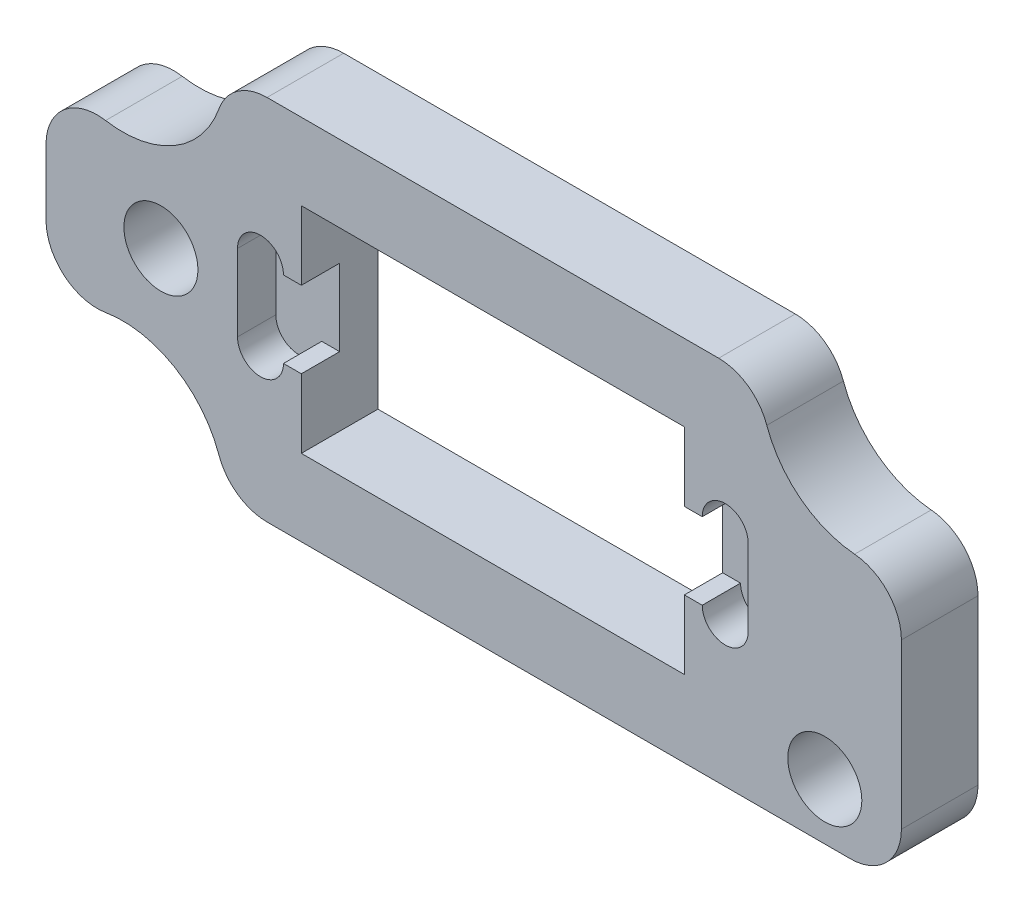
ISO-10303-21;
HEADER;
FILE_DESCRIPTION(('STEP AP214'),'2;1');
FILE_NAME('part.step','',(''),(''),'','','');
FILE_SCHEMA(('AUTOMOTIVE_DESIGN { 1 0 10303 214 1 1 1 1 }'));
ENDSEC;
DATA;
#1=APPLICATION_CONTEXT('core data for automotive mechanical design processes');
#2=APPLICATION_PROTOCOL_DEFINITION('international standard','automotive_design',2000,#1);
#3=PRODUCT_CONTEXT('',#1,'mechanical');
#4=PRODUCT('Part','Part','',(#3));
#5=PRODUCT_RELATED_PRODUCT_CATEGORY('part','',(#4));
#6=PRODUCT_DEFINITION_FORMATION('','',#4);
#7=PRODUCT_DEFINITION_CONTEXT('part definition',#1,'design');
#8=PRODUCT_DEFINITION('design','',#6,#7);
#9=PRODUCT_DEFINITION_SHAPE('','',#8);
#10=(LENGTH_UNIT() NAMED_UNIT(*) SI_UNIT(.MILLI.,.METRE.));
#11=(NAMED_UNIT(*) PLANE_ANGLE_UNIT() SI_UNIT($,.RADIAN.));
#12=(NAMED_UNIT(*) SI_UNIT($,.STERADIAN.) SOLID_ANGLE_UNIT());
#13=UNCERTAINTY_MEASURE_WITH_UNIT(LENGTH_MEASURE(1.E-05),#10,'distance_accuracy_value','');
#14=(GEOMETRIC_REPRESENTATION_CONTEXT(3) GLOBAL_UNCERTAINTY_ASSIGNED_CONTEXT((#13)) GLOBAL_UNIT_ASSIGNED_CONTEXT((#10,
#11,#12)) REPRESENTATION_CONTEXT('',''));
#15=CARTESIAN_POINT('',(0.,0.,0.));
#16=DIRECTION('',(0.,0.,1.));
#17=DIRECTION('',(1.,0.,0.));
#18=AXIS2_PLACEMENT_3D('',#15,#16,#17);
#19=CARTESIAN_POINT('',(0.,0.,3.));
#20=DIRECTION('',(0.,0.,-1.));
#21=DIRECTION('',(-1.,0.,0.));
#22=AXIS2_PLACEMENT_3D('',#19,#20,#21);
#23=PLANE('',#22);
#24=CARTESIAN_POINT('',(13.,-5.,3.));
#25=DIRECTION('',(0.,0.,1.));
#26=DIRECTION('',(1.,0.,0.));
#27=AXIS2_PLACEMENT_3D('',#24,#25,#26);
#28=CIRCLE('',#27,1.45);
#29=CARTESIAN_POINT('',(14.45,-5.,3.));
#30=VERTEX_POINT('',#29);
#31=EDGE_CURVE('E682',#30,#30,#28,.T.);
#32=ORIENTED_EDGE('',*,*,#31,.F.);
#33=EDGE_LOOP('',(#32));
#34=FACE_BOUND('',#33,.T.);
#35=CARTESIAN_POINT('',(-13.,0.,3.));
#36=DIRECTION('',(0.,0.,1.));
#37=DIRECTION('',(1.,0.,0.));
#38=AXIS2_PLACEMENT_3D('',#35,#36,#37);
#39=CIRCLE('',#38,1.45);
#40=CARTESIAN_POINT('',(-11.55,0.,3.));
#41=VERTEX_POINT('',#40);
#42=EDGE_CURVE('E393',#41,#41,#39,.T.);
#43=ORIENTED_EDGE('',*,*,#42,.F.);
#44=EDGE_LOOP('',(#43));
#45=FACE_BOUND('',#44,.T.);
#46=DIRECTION('',(1.,0.,0.));
#47=VECTOR('',#46,1.);
#48=CARTESIAN_POINT('',(-17.5,-7.2,3.));
#49=LINE('',#48,#47);
#50=CARTESIAN_POINT('',(-8.84314575050762,-7.2,3.));
#51=VERTEX_POINT('',#50);
#52=CARTESIAN_POINT('',(14.,-7.2,3.));
#53=VERTEX_POINT('',#52);
#54=EDGE_CURVE('E364',#51,#53,#49,.T.);
#55=ORIENTED_EDGE('',*,*,#54,.T.);
#56=CARTESIAN_POINT('',(14.,-5.2,3.));
#57=DIRECTION('',(0.,0.,-1.));
#58=DIRECTION('',(-1.,0.,0.));
#59=AXIS2_PLACEMENT_3D('',#56,#57,#58);
#60=CIRCLE('',#59,2.);
#61=CARTESIAN_POINT('',(16.,-5.2,3.));
#62=VERTEX_POINT('',#61);
#63=EDGE_CURVE('E419',#53,#62,#60,.F.);
#64=ORIENTED_EDGE('',*,*,#63,.T.);
#65=DIRECTION('',(0.,-1.,0.));
#66=VECTOR('',#65,1.);
#67=CARTESIAN_POINT('',(16.,-7.2,3.));
#68=LINE('',#67,#66);
#69=CARTESIAN_POINT('',(16.,1.2208696284493,3.));
#70=VERTEX_POINT('',#69);
#71=EDGE_CURVE('E649',#70,#62,#68,.T.);
#72=ORIENTED_EDGE('',*,*,#71,.F.);
#73=CARTESIAN_POINT('',(14.,1.2208696284493,3.));
#74=DIRECTION('',(0.,0.,-1.));
#75=DIRECTION('',(-1.,0.,0.));
#76=AXIS2_PLACEMENT_3D('',#73,#74,#75);
#77=CIRCLE('',#76,2.);
#78=CARTESIAN_POINT('',(14.1666666666667,3.21391308563287,3.));
#79=VERTEX_POINT('',#78);
#80=EDGE_CURVE('E416',#70,#79,#77,.F.);
#81=ORIENTED_EDGE('',*,*,#80,.T.);
#82=CARTESIAN_POINT('',(14.5,7.2,3.));
#83=DIRECTION('',(0.,0.,1.));
#84=DIRECTION('',(-1.,0.,0.));
#85=AXIS2_PLACEMENT_3D('',#82,#83,#84);
#86=CIRCLE('',#85,4.);
#87=CARTESIAN_POINT('',(10.7287638336718,5.86666666666667,3.));
#88=VERTEX_POINT('',#87);
#89=EDGE_CURVE('E504',#88,#79,#86,.T.);
#90=ORIENTED_EDGE('',*,*,#89,.F.);
#91=CARTESIAN_POINT('',(8.84314575050763,5.2,3.));
#92=DIRECTION('',(0.,0.,-1.));
#93=DIRECTION('',(-1.,0.,0.));
#94=AXIS2_PLACEMENT_3D('',#91,#92,#93);
#95=CIRCLE('',#94,2.);
#96=CARTESIAN_POINT('',(8.84314575050763,7.2,3.));
#97=VERTEX_POINT('',#96);
#98=EDGE_CURVE('E410',#88,#97,#95,.F.);
#99=ORIENTED_EDGE('',*,*,#98,.T.);
#100=DIRECTION('',(-1.,0.,0.));
#101=VECTOR('',#100,1.);
#102=CARTESIAN_POINT('',(-17.5,7.2,3.));
#103=LINE('',#102,#101);
#104=CARTESIAN_POINT('',(-8.84314575050762,7.2,3.));
#105=VERTEX_POINT('',#104);
#106=EDGE_CURVE('E355',#97,#105,#103,.T.);
#107=ORIENTED_EDGE('',*,*,#106,.T.);
#108=CARTESIAN_POINT('',(-8.84314575050762,5.2,3.));
#109=DIRECTION('',(0.,0.,-1.));
#110=DIRECTION('',(-1.,0.,0.));
#111=AXIS2_PLACEMENT_3D('',#108,#109,#110);
#112=CIRCLE('',#111,2.);
#113=CARTESIAN_POINT('',(-10.7287638336717,5.86666666666667,3.));
#114=VERTEX_POINT('',#113);
#115=EDGE_CURVE('E401',#105,#114,#112,.F.);
#116=ORIENTED_EDGE('',*,*,#115,.T.);
#117=CARTESIAN_POINT('',(-14.5,7.2,3.));
#118=DIRECTION('',(0.,0.,1.));
#119=DIRECTION('',(1.,0.,0.));
#120=AXIS2_PLACEMENT_3D('',#117,#118,#119);
#121=CIRCLE('',#120,4.);
#122=CARTESIAN_POINT('',(-15.1666666666667,3.25594681126692,3.));
#123=VERTEX_POINT('',#122);
#124=EDGE_CURVE('E484',#123,#114,#121,.T.);
#125=ORIENTED_EDGE('',*,*,#124,.F.);
#126=CARTESIAN_POINT('',(-15.5,1.28392021690038,3.));
#127=DIRECTION('',(0.,0.,-1.));
#128=DIRECTION('',(-1.,0.,0.));
#129=AXIS2_PLACEMENT_3D('',#126,#127,#128);
#130=CIRCLE('',#129,2.);
#131=CARTESIAN_POINT('',(-17.5,1.28392021690038,3.));
#132=VERTEX_POINT('',#131);
#133=EDGE_CURVE('E407',#123,#132,#130,.F.);
#134=ORIENTED_EDGE('',*,*,#133,.T.);
#135=DIRECTION('',(0.,-1.,0.));
#136=VECTOR('',#135,1.);
#137=CARTESIAN_POINT('',(-17.5,-7.2,3.));
#138=LINE('',#137,#136);
#139=CARTESIAN_POINT('',(-17.5,-1.28392021690038,3.));
#140=VERTEX_POINT('',#139);
#141=EDGE_CURVE('E359',#132,#140,#138,.T.);
#142=ORIENTED_EDGE('',*,*,#141,.T.);
#143=CARTESIAN_POINT('',(-15.5,-1.28392021690038,3.));
#144=DIRECTION('',(0.,0.,-1.));
#145=DIRECTION('',(-1.,0.,0.));
#146=AXIS2_PLACEMENT_3D('',#143,#144,#145);
#147=CIRCLE('',#146,2.);
#148=CARTESIAN_POINT('',(-15.1666666666667,-3.25594681126692,3.));
#149=VERTEX_POINT('',#148);
#150=EDGE_CURVE('E404',#140,#149,#147,.F.);
#151=ORIENTED_EDGE('',*,*,#150,.T.);
#152=CARTESIAN_POINT('',(-14.5,-7.2,3.));
#153=DIRECTION('',(0.,0.,1.));
#154=DIRECTION('',(-1.,0.,0.));
#155=AXIS2_PLACEMENT_3D('',#152,#153,#154);
#156=CIRCLE('',#155,4.);
#157=CARTESIAN_POINT('',(-10.7287638336717,-5.86666666666667,3.));
#158=VERTEX_POINT('',#157);
#159=EDGE_CURVE('E642',#158,#149,#156,.T.);
#160=ORIENTED_EDGE('',*,*,#159,.F.);
#161=CARTESIAN_POINT('',(-8.84314575050762,-5.2,3.));
#162=DIRECTION('',(0.,0.,-1.));
#163=DIRECTION('',(-1.,0.,0.));
#164=AXIS2_PLACEMENT_3D('',#161,#162,#163);
#165=CIRCLE('',#164,2.);
#166=EDGE_CURVE('E413',#158,#51,#165,.F.);
#167=ORIENTED_EDGE('',*,*,#166,.T.);
#168=EDGE_LOOP('',(#55,#64,#72,#81,#90,#99,#107,#116,#125,#134,#142,#151,#160,#167));
#169=FACE_BOUND('',#168,.T.);
#170=DIRECTION('',(1.,0.,0.));
#171=VECTOR('',#170,1.);
#172=CARTESIAN_POINT('',(-10.,-1.5,3.));
#173=LINE('',#172,#171);
#174=CARTESIAN_POINT('',(-8.2,-1.5,3.));
#175=VERTEX_POINT('',#174);
#176=CARTESIAN_POINT('',(-7.5,-1.5,3.));
#177=VERTEX_POINT('',#176);
#178=EDGE_CURVE('E275',#175,#177,#173,.T.);
#179=ORIENTED_EDGE('',*,*,#178,.F.);
#180=CARTESIAN_POINT('',(-9.1,-1.5,3.));
#181=DIRECTION('',(0.,0.,1.));
#182=DIRECTION('',(1.,0.,0.));
#183=AXIS2_PLACEMENT_3D('',#180,#181,#182);
#184=CIRCLE('',#183,0.9);
#185=CARTESIAN_POINT('',(-10.,-1.5,3.));
#186=VERTEX_POINT('',#185);
#187=EDGE_CURVE('E665',#186,#175,#184,.T.);
#188=ORIENTED_EDGE('',*,*,#187,.F.);
#189=DIRECTION('',(0.,-1.,0.));
#190=VECTOR('',#189,1.);
#191=CARTESIAN_POINT('',(-10.,-1.5,3.));
#192=LINE('',#191,#190);
#193=CARTESIAN_POINT('',(-10.,1.5,3.));
#194=VERTEX_POINT('',#193);
#195=EDGE_CURVE('E276',#194,#186,#192,.T.);
#196=ORIENTED_EDGE('',*,*,#195,.F.);
#197=CARTESIAN_POINT('',(-9.1,1.5,3.));
#198=DIRECTION('',(0.,0.,1.));
#199=DIRECTION('',(1.,0.,0.));
#200=AXIS2_PLACEMENT_3D('',#197,#198,#199);
#201=CIRCLE('',#200,0.9);
#202=CARTESIAN_POINT('',(-8.2,1.5,3.));
#203=VERTEX_POINT('',#202);
#204=EDGE_CURVE('E552',#203,#194,#201,.T.);
#205=ORIENTED_EDGE('',*,*,#204,.F.);
#206=DIRECTION('',(-1.,0.,0.));
#207=VECTOR('',#206,1.);
#208=CARTESIAN_POINT('',(-10.,1.5,3.));
#209=LINE('',#208,#207);
#210=CARTESIAN_POINT('',(-7.5,1.5,3.));
#211=VERTEX_POINT('',#210);
#212=EDGE_CURVE('E532',#211,#203,#209,.T.);
#213=ORIENTED_EDGE('',*,*,#212,.F.);
#214=DIRECTION('',(0.,-1.,0.));
#215=VECTOR('',#214,1.);
#216=CARTESIAN_POINT('',(-7.5,-4.2,3.));
#217=LINE('',#216,#215);
#218=CARTESIAN_POINT('',(-7.5,4.2,3.));
#219=VERTEX_POINT('',#218);
#220=EDGE_CURVE('E318',#219,#211,#217,.T.);
#221=ORIENTED_EDGE('',*,*,#220,.F.);
#222=DIRECTION('',(-1.,0.,0.));
#223=VECTOR('',#222,1.);
#224=CARTESIAN_POINT('',(-7.5,4.2,3.));
#225=LINE('',#224,#223);
#226=CARTESIAN_POINT('',(7.5,4.2,3.));
#227=VERTEX_POINT('',#226);
#228=EDGE_CURVE('E313',#227,#219,#225,.T.);
#229=ORIENTED_EDGE('',*,*,#228,.F.);
#230=DIRECTION('',(0.,1.,0.));
#231=VECTOR('',#230,1.);
#232=CARTESIAN_POINT('',(7.5,-4.2,3.));
#233=LINE('',#232,#231);
#234=CARTESIAN_POINT('',(7.5,1.5,3.));
#235=VERTEX_POINT('',#234);
#236=EDGE_CURVE('E314',#235,#227,#233,.T.);
#237=ORIENTED_EDGE('',*,*,#236,.F.);
#238=CARTESIAN_POINT('',(8.2,1.5,3.));
#239=VERTEX_POINT('',#238);
#240=EDGE_CURVE('E282',#239,#235,#209,.T.);
#241=ORIENTED_EDGE('',*,*,#240,.F.);
#242=CARTESIAN_POINT('',(9.1,1.5,3.));
#243=DIRECTION('',(0.,0.,1.));
#244=DIRECTION('',(1.,0.,0.));
#245=AXIS2_PLACEMENT_3D('',#242,#243,#244);
#246=CIRCLE('',#245,0.9);
#247=CARTESIAN_POINT('',(10.,1.5,3.));
#248=VERTEX_POINT('',#247);
#249=EDGE_CURVE('E671',#248,#239,#246,.T.);
#250=ORIENTED_EDGE('',*,*,#249,.F.);
#251=DIRECTION('',(0.,1.,0.));
#252=VECTOR('',#251,1.);
#253=CARTESIAN_POINT('',(10.,-1.5,3.));
#254=LINE('',#253,#252);
#255=CARTESIAN_POINT('',(10.,-1.5,3.));
#256=VERTEX_POINT('',#255);
#257=EDGE_CURVE('E267',#256,#248,#254,.T.);
#258=ORIENTED_EDGE('',*,*,#257,.F.);
#259=CARTESIAN_POINT('',(9.1,-1.5,3.));
#260=DIRECTION('',(0.,0.,1.));
#261=DIRECTION('',(1.,0.,0.));
#262=AXIS2_PLACEMENT_3D('',#259,#260,#261);
#263=CIRCLE('',#262,0.9);
#264=CARTESIAN_POINT('',(8.2,-1.5,3.));
#265=VERTEX_POINT('',#264);
#266=EDGE_CURVE('E246',#265,#256,#263,.T.);
#267=ORIENTED_EDGE('',*,*,#266,.F.);
#268=CARTESIAN_POINT('',(7.5,-1.5,3.));
#269=VERTEX_POINT('',#268);
#270=EDGE_CURVE('E263',#269,#265,#173,.T.);
#271=ORIENTED_EDGE('',*,*,#270,.F.);
#272=CARTESIAN_POINT('',(7.5,-4.2,3.));
#273=VERTEX_POINT('',#272);
#274=EDGE_CURVE('E310',#273,#269,#233,.T.);
#275=ORIENTED_EDGE('',*,*,#274,.F.);
#276=DIRECTION('',(1.,0.,0.));
#277=VECTOR('',#276,1.);
#278=CARTESIAN_POINT('',(-7.5,-4.2,3.));
#279=LINE('',#278,#277);
#280=CARTESIAN_POINT('',(-7.5,-4.2,3.));
#281=VERTEX_POINT('',#280);
#282=EDGE_CURVE('E322',#281,#273,#279,.T.);
#283=ORIENTED_EDGE('',*,*,#282,.F.);
#284=EDGE_CURVE('E317',#177,#281,#217,.T.);
#285=ORIENTED_EDGE('',*,*,#284,.F.);
#286=EDGE_LOOP('',(#179,#188,#196,#205,#213,#221,#229,#237,#241,#250,#258,#267,#271,#275,#283,#285));
#287=FACE_BOUND('',#286,.T.);
#288=ADVANCED_FACE('F45',(#34,#45,#169,#287),#23,.F.);
#289=CARTESIAN_POINT('',(0.,0.,0.));
#290=DIRECTION('',(0.,0.,-1.));
#291=DIRECTION('',(-1.,0.,0.));
#292=AXIS2_PLACEMENT_3D('',#289,#290,#291);
#293=PLANE('',#292);
#294=CARTESIAN_POINT('',(13.,-5.,0.));
#295=DIRECTION('',(0.,0.,1.));
#296=DIRECTION('',(1.,0.,0.));
#297=AXIS2_PLACEMENT_3D('',#294,#295,#296);
#298=CIRCLE('',#297,1.45);
#299=CARTESIAN_POINT('',(14.45,-5.,0.));
#300=VERTEX_POINT('',#299);
#301=EDGE_CURVE('E680',#300,#300,#298,.T.);
#302=ORIENTED_EDGE('',*,*,#301,.T.);
#303=EDGE_LOOP('',(#302));
#304=FACE_BOUND('',#303,.T.);
#305=DIRECTION('',(0.,-1.,0.));
#306=VECTOR('',#305,1.);
#307=CARTESIAN_POINT('',(16.,-7.2,0.));
#308=LINE('',#307,#306);
#309=CARTESIAN_POINT('',(16.,1.2208696284493,0.));
#310=VERTEX_POINT('',#309);
#311=CARTESIAN_POINT('',(16.,-5.2,0.));
#312=VERTEX_POINT('',#311);
#313=EDGE_CURVE('E647',#310,#312,#308,.T.);
#314=ORIENTED_EDGE('',*,*,#313,.T.);
#315=CARTESIAN_POINT('',(14.,-5.2,0.));
#316=DIRECTION('',(0.,0.,-1.));
#317=DIRECTION('',(-1.,0.,0.));
#318=AXIS2_PLACEMENT_3D('',#315,#316,#317);
#319=CIRCLE('',#318,2.);
#320=CARTESIAN_POINT('',(14.,-7.2,0.));
#321=VERTEX_POINT('',#320);
#322=EDGE_CURVE('E444',#312,#321,#319,.T.);
#323=ORIENTED_EDGE('',*,*,#322,.T.);
#324=DIRECTION('',(1.,0.,0.));
#325=VECTOR('',#324,1.);
#326=CARTESIAN_POINT('',(-17.5,-7.2,0.));
#327=LINE('',#326,#325);
#328=CARTESIAN_POINT('',(-8.84314575050762,-7.2,0.));
#329=VERTEX_POINT('',#328);
#330=EDGE_CURVE('E360',#329,#321,#327,.T.);
#331=ORIENTED_EDGE('',*,*,#330,.F.);
#332=CARTESIAN_POINT('',(-8.84314575050762,-5.2,0.));
#333=DIRECTION('',(0.,0.,-1.));
#334=DIRECTION('',(-1.,0.,0.));
#335=AXIS2_PLACEMENT_3D('',#332,#333,#334);
#336=CIRCLE('',#335,2.);
#337=CARTESIAN_POINT('',(-10.7287638336717,-5.86666666666667,0.));
#338=VERTEX_POINT('',#337);
#339=EDGE_CURVE('E439',#329,#338,#336,.T.);
#340=ORIENTED_EDGE('',*,*,#339,.T.);
#341=CARTESIAN_POINT('',(-14.5,-7.2,0.));
#342=DIRECTION('',(0.,0.,-1.));
#343=DIRECTION('',(-1.,0.,0.));
#344=AXIS2_PLACEMENT_3D('',#341,#342,#343);
#345=CIRCLE('',#344,4.);
#346=CARTESIAN_POINT('',(-15.1666666666667,-3.25594681126692,0.));
#347=VERTEX_POINT('',#346);
#348=EDGE_CURVE('E493',#347,#338,#345,.T.);
#349=ORIENTED_EDGE('',*,*,#348,.F.);
#350=CARTESIAN_POINT('',(-15.5,-1.28392021690038,0.));
#351=DIRECTION('',(0.,0.,-1.));
#352=DIRECTION('',(-1.,0.,0.));
#353=AXIS2_PLACEMENT_3D('',#350,#351,#352);
#354=CIRCLE('',#353,2.);
#355=CARTESIAN_POINT('',(-17.5,-1.28392021690038,0.));
#356=VERTEX_POINT('',#355);
#357=EDGE_CURVE('E431',#347,#356,#354,.T.);
#358=ORIENTED_EDGE('',*,*,#357,.T.);
#359=DIRECTION('',(0.,-1.,0.));
#360=VECTOR('',#359,1.);
#361=CARTESIAN_POINT('',(-17.5,-7.2,0.));
#362=LINE('',#361,#360);
#363=CARTESIAN_POINT('',(-17.5,1.28392021690038,0.));
#364=VERTEX_POINT('',#363);
#365=EDGE_CURVE('E372',#364,#356,#362,.T.);
#366=ORIENTED_EDGE('',*,*,#365,.F.);
#367=CARTESIAN_POINT('',(-15.5,1.28392021690038,0.));
#368=DIRECTION('',(0.,0.,-1.));
#369=DIRECTION('',(-1.,0.,0.));
#370=AXIS2_PLACEMENT_3D('',#367,#368,#369);
#371=CIRCLE('',#370,2.);
#372=CARTESIAN_POINT('',(-15.1666666666667,3.25594681126692,0.));
#373=VERTEX_POINT('',#372);
#374=EDGE_CURVE('E434',#364,#373,#371,.T.);
#375=ORIENTED_EDGE('',*,*,#374,.T.);
#376=CARTESIAN_POINT('',(-14.5,7.2,0.));
#377=DIRECTION('',(0.,0.,-1.));
#378=DIRECTION('',(-1.,0.,0.));
#379=AXIS2_PLACEMENT_3D('',#376,#377,#378);
#380=CIRCLE('',#379,4.);
#381=CARTESIAN_POINT('',(-10.7287638336717,5.86666666666667,0.));
#382=VERTEX_POINT('',#381);
#383=EDGE_CURVE('E481',#382,#373,#380,.T.);
#384=ORIENTED_EDGE('',*,*,#383,.F.);
#385=CARTESIAN_POINT('',(-8.84314575050762,5.2,0.));
#386=DIRECTION('',(0.,0.,-1.));
#387=DIRECTION('',(-1.,0.,0.));
#388=AXIS2_PLACEMENT_3D('',#385,#386,#387);
#389=CIRCLE('',#388,2.);
#390=CARTESIAN_POINT('',(-8.84314575050762,7.2,0.));
#391=VERTEX_POINT('',#390);
#392=EDGE_CURVE('E428',#382,#391,#389,.T.);
#393=ORIENTED_EDGE('',*,*,#392,.T.);
#394=DIRECTION('',(-1.,0.,0.));
#395=VECTOR('',#394,1.);
#396=CARTESIAN_POINT('',(-17.5,7.2,0.));
#397=LINE('',#396,#395);
#398=CARTESIAN_POINT('',(8.84314575050763,7.2,0.));
#399=VERTEX_POINT('',#398);
#400=EDGE_CURVE('E354',#399,#391,#397,.T.);
#401=ORIENTED_EDGE('',*,*,#400,.F.);
#402=CARTESIAN_POINT('',(8.84314575050763,5.2,0.));
#403=DIRECTION('',(0.,0.,-1.));
#404=DIRECTION('',(-1.,0.,0.));
#405=AXIS2_PLACEMENT_3D('',#402,#403,#404);
#406=CIRCLE('',#405,2.);
#407=CARTESIAN_POINT('',(10.7287638336718,5.86666666666667,0.));
#408=VERTEX_POINT('',#407);
#409=EDGE_CURVE('E61',#399,#408,#406,.T.);
#410=ORIENTED_EDGE('',*,*,#409,.T.);
#411=CARTESIAN_POINT('',(14.5,7.2,0.));
#412=DIRECTION('',(0.,0.,-1.));
#413=DIRECTION('',(-1.,0.,0.));
#414=AXIS2_PLACEMENT_3D('',#411,#412,#413);
#415=CIRCLE('',#414,4.);
#416=CARTESIAN_POINT('',(14.1666666666667,3.21391308563287,0.));
#417=VERTEX_POINT('',#416);
#418=EDGE_CURVE('E492',#417,#408,#415,.T.);
#419=ORIENTED_EDGE('',*,*,#418,.F.);
#420=CARTESIAN_POINT('',(14.,1.2208696284493,0.));
#421=DIRECTION('',(0.,0.,-1.));
#422=DIRECTION('',(-1.,0.,0.));
#423=AXIS2_PLACEMENT_3D('',#420,#421,#422);
#424=CIRCLE('',#423,2.);
#425=EDGE_CURVE('E69',#417,#310,#424,.T.);
#426=ORIENTED_EDGE('',*,*,#425,.T.);
#427=EDGE_LOOP('',(#314,#323,#331,#340,#349,#358,#366,#375,#384,#393,#401,#410,#419,#426));
#428=FACE_BOUND('',#427,.T.);
#429=CARTESIAN_POINT('',(-13.,0.,0.));
#430=DIRECTION('',(0.,0.,-1.));
#431=DIRECTION('',(-1.,0.,0.));
#432=AXIS2_PLACEMENT_3D('',#429,#430,#431);
#433=CIRCLE('',#432,1.45);
#434=CARTESIAN_POINT('',(-14.45,0.,0.));
#435=VERTEX_POINT('',#434);
#436=EDGE_CURVE('E389',#435,#435,#433,.T.);
#437=ORIENTED_EDGE('',*,*,#436,.F.);
#438=EDGE_LOOP('',(#437));
#439=FACE_BOUND('',#438,.T.);
#440=DIRECTION('',(1.,0.,0.));
#441=VECTOR('',#440,1.);
#442=CARTESIAN_POINT('',(-7.5,-4.2,0.));
#443=LINE('',#442,#441);
#444=CARTESIAN_POINT('',(-7.5,-4.2,0.));
#445=VERTEX_POINT('',#444);
#446=CARTESIAN_POINT('',(7.5,-4.2,0.));
#447=VERTEX_POINT('',#446);
#448=EDGE_CURVE('E337',#445,#447,#443,.T.);
#449=ORIENTED_EDGE('',*,*,#448,.T.);
#450=DIRECTION('',(0.,1.,0.));
#451=VECTOR('',#450,1.);
#452=CARTESIAN_POINT('',(7.5,-4.2,0.));
#453=LINE('',#452,#451);
#454=CARTESIAN_POINT('',(7.5,4.2,0.));
#455=VERTEX_POINT('',#454);
#456=EDGE_CURVE('E309',#447,#455,#453,.T.);
#457=ORIENTED_EDGE('',*,*,#456,.T.);
#458=DIRECTION('',(-1.,0.,0.));
#459=VECTOR('',#458,1.);
#460=CARTESIAN_POINT('',(-7.5,4.2,0.));
#461=LINE('',#460,#459);
#462=CARTESIAN_POINT('',(-7.5,4.2,0.));
#463=VERTEX_POINT('',#462);
#464=EDGE_CURVE('E329',#455,#463,#461,.T.);
#465=ORIENTED_EDGE('',*,*,#464,.T.);
#466=DIRECTION('',(0.,-1.,0.));
#467=VECTOR('',#466,1.);
#468=CARTESIAN_POINT('',(-7.5,-4.2,0.));
#469=LINE('',#468,#467);
#470=EDGE_CURVE('E333',#463,#445,#469,.T.);
#471=ORIENTED_EDGE('',*,*,#470,.T.);
#472=EDGE_LOOP('',(#449,#457,#465,#471));
#473=FACE_BOUND('',#472,.T.);
#474=ADVANCED_FACE('F488',(#304,#428,#439,#473),#293,.T.);
#475=CARTESIAN_POINT('',(-17.5,7.2,3.));
#476=DIRECTION('',(0.,-1.,0.));
#477=DIRECTION('',(0.,0.,-1.));
#478=AXIS2_PLACEMENT_3D('',#475,#476,#477);
#479=PLANE('',#478);
#480=ORIENTED_EDGE('',*,*,#106,.F.);
#481=DIRECTION('',(0.,0.,1.));
#482=VECTOR('',#481,1.);
#483=CARTESIAN_POINT('',(8.84314575050763,7.2,3.));
#484=LINE('',#483,#482);
#485=EDGE_CURVE('E463',#97,#399,#484,.F.);
#486=ORIENTED_EDGE('',*,*,#485,.T.);
#487=ORIENTED_EDGE('',*,*,#400,.T.);
#488=DIRECTION('',(0.,0.,1.));
#489=VECTOR('',#488,1.);
#490=CARTESIAN_POINT('',(-8.84314575050762,7.2,3.));
#491=LINE('',#490,#489);
#492=EDGE_CURVE('E459',#391,#105,#491,.T.);
#493=ORIENTED_EDGE('',*,*,#492,.T.);
#494=EDGE_LOOP('',(#480,#486,#487,#493));
#495=FACE_BOUND('',#494,.T.);
#496=ADVANCED_FACE('F498',(#495),#479,.F.);
#497=CARTESIAN_POINT('',(-17.5,-7.2,3.));
#498=DIRECTION('',(1.,0.,0.));
#499=DIRECTION('',(0.,0.,-1.));
#500=AXIS2_PLACEMENT_3D('',#497,#498,#499);
#501=PLANE('',#500);
#502=ORIENTED_EDGE('',*,*,#141,.F.);
#503=DIRECTION('',(0.,0.,1.));
#504=VECTOR('',#503,1.);
#505=CARTESIAN_POINT('',(-17.5,1.28392021690038,3.));
#506=LINE('',#505,#504);
#507=EDGE_CURVE('E471',#132,#364,#506,.F.);
#508=ORIENTED_EDGE('',*,*,#507,.T.);
#509=ORIENTED_EDGE('',*,*,#365,.T.);
#510=DIRECTION('',(0.,0.,1.));
#511=VECTOR('',#510,1.);
#512=CARTESIAN_POINT('',(-17.5,-1.28392021690038,3.));
#513=LINE('',#512,#511);
#514=EDGE_CURVE('E467',#356,#140,#513,.T.);
#515=ORIENTED_EDGE('',*,*,#514,.T.);
#516=EDGE_LOOP('',(#502,#508,#509,#515));
#517=FACE_BOUND('',#516,.T.);
#518=ADVANCED_FACE('F593',(#517),#501,.F.);
#519=CARTESIAN_POINT('',(-17.5,-7.2,3.));
#520=DIRECTION('',(0.,1.,0.));
#521=DIRECTION('',(0.,0.,1.));
#522=AXIS2_PLACEMENT_3D('',#519,#520,#521);
#523=PLANE('',#522);
#524=ORIENTED_EDGE('',*,*,#330,.T.);
#525=DIRECTION('',(0.,0.,1.));
#526=VECTOR('',#525,1.);
#527=CARTESIAN_POINT('',(14.,-7.2,3.));
#528=LINE('',#527,#526);
#529=EDGE_CURVE('E397',#321,#53,#528,.T.);
#530=ORIENTED_EDGE('',*,*,#529,.T.);
#531=ORIENTED_EDGE('',*,*,#54,.F.);
#532=DIRECTION('',(0.,0.,1.));
#533=VECTOR('',#532,1.);
#534=CARTESIAN_POINT('',(-8.84314575050762,-7.2,3.));
#535=LINE('',#534,#533);
#536=EDGE_CURVE('E388',#51,#329,#535,.F.);
#537=ORIENTED_EDGE('',*,*,#536,.T.);
#538=EDGE_LOOP('',(#524,#530,#531,#537));
#539=FACE_BOUND('',#538,.T.);
#540=ADVANCED_FACE('F600',(#539),#523,.F.);
#541=CARTESIAN_POINT('',(7.5,-4.2,3.));
#542=DIRECTION('',(-1.,0.,0.));
#543=DIRECTION('',(0.,0.,1.));
#544=AXIS2_PLACEMENT_3D('',#541,#542,#543);
#545=PLANE('',#544);
#546=DIRECTION('',(0.,0.,1.));
#547=VECTOR('',#546,1.);
#548=CARTESIAN_POINT('',(7.5,-1.5,3.));
#549=LINE('',#548,#547);
#550=CARTESIAN_POINT('',(7.5,-1.5,1.5));
#551=VERTEX_POINT('',#550);
#552=EDGE_CURVE('E273',#551,#269,#549,.T.);
#553=ORIENTED_EDGE('',*,*,#552,.F.);
#554=DIRECTION('',(0.,-1.,0.));
#555=VECTOR('',#554,1.);
#556=CARTESIAN_POINT('',(7.5,-4.2,1.5));
#557=LINE('',#556,#555);
#558=CARTESIAN_POINT('',(7.5,1.5,1.5));
#559=VERTEX_POINT('',#558);
#560=EDGE_CURVE('E289',#559,#551,#557,.T.);
#561=ORIENTED_EDGE('',*,*,#560,.F.);
#562=DIRECTION('',(0.,0.,-1.));
#563=VECTOR('',#562,1.);
#564=CARTESIAN_POINT('',(7.5,1.5,3.));
#565=LINE('',#564,#563);
#566=EDGE_CURVE('E303',#235,#559,#565,.T.);
#567=ORIENTED_EDGE('',*,*,#566,.F.);
#568=ORIENTED_EDGE('',*,*,#236,.T.);
#569=DIRECTION('',(0.,0.,-1.));
#570=VECTOR('',#569,1.);
#571=CARTESIAN_POINT('',(7.5,4.2,3.));
#572=LINE('',#571,#570);
#573=EDGE_CURVE('E350',#227,#455,#572,.T.);
#574=ORIENTED_EDGE('',*,*,#573,.T.);
#575=ORIENTED_EDGE('',*,*,#456,.F.);
#576=DIRECTION('',(0.,0.,-1.));
#577=VECTOR('',#576,1.);
#578=CARTESIAN_POINT('',(7.5,-4.2,3.));
#579=LINE('',#578,#577);
#580=EDGE_CURVE('E325',#273,#447,#579,.T.);
#581=ORIENTED_EDGE('',*,*,#580,.F.);
#582=ORIENTED_EDGE('',*,*,#274,.T.);
#583=EDGE_LOOP('',(#553,#561,#567,#568,#574,#575,#581,#582));
#584=FACE_BOUND('',#583,.T.);
#585=ADVANCED_FACE('F583',(#584),#545,.T.);
#586=CARTESIAN_POINT('',(-7.5,4.2,3.));
#587=DIRECTION('',(0.,-1.,0.));
#588=DIRECTION('',(0.,0.,-1.));
#589=AXIS2_PLACEMENT_3D('',#586,#587,#588);
#590=PLANE('',#589);
#591=ORIENTED_EDGE('',*,*,#464,.F.);
#592=ORIENTED_EDGE('',*,*,#573,.F.);
#593=ORIENTED_EDGE('',*,*,#228,.T.);
#594=DIRECTION('',(0.,0.,-1.));
#595=VECTOR('',#594,1.);
#596=CARTESIAN_POINT('',(-7.5,4.2,3.));
#597=LINE('',#596,#595);
#598=EDGE_CURVE('E347',#219,#463,#597,.T.);
#599=ORIENTED_EDGE('',*,*,#598,.T.);
#600=EDGE_LOOP('',(#591,#592,#593,#599));
#601=FACE_BOUND('',#600,.T.);
#602=ADVANCED_FACE('F560',(#601),#590,.T.);
#603=CARTESIAN_POINT('',(-7.5,-4.2,3.));
#604=DIRECTION('',(1.,0.,0.));
#605=DIRECTION('',(0.,0.,-1.));
#606=AXIS2_PLACEMENT_3D('',#603,#604,#605);
#607=PLANE('',#606);
#608=DIRECTION('',(0.,0.,-1.));
#609=VECTOR('',#608,1.);
#610=CARTESIAN_POINT('',(-7.5,-1.5,3.));
#611=LINE('',#610,#609);
#612=CARTESIAN_POINT('',(-7.5,-1.5,1.5));
#613=VERTEX_POINT('',#612);
#614=EDGE_CURVE('E384',#177,#613,#611,.T.);
#615=ORIENTED_EDGE('',*,*,#614,.F.);
#616=ORIENTED_EDGE('',*,*,#284,.T.);
#617=DIRECTION('',(0.,0.,-1.));
#618=VECTOR('',#617,1.);
#619=CARTESIAN_POINT('',(-7.5,-4.2,3.));
#620=LINE('',#619,#618);
#621=EDGE_CURVE('E344',#281,#445,#620,.T.);
#622=ORIENTED_EDGE('',*,*,#621,.T.);
#623=ORIENTED_EDGE('',*,*,#470,.F.);
#624=ORIENTED_EDGE('',*,*,#598,.F.);
#625=ORIENTED_EDGE('',*,*,#220,.T.);
#626=DIRECTION('',(0.,0.,1.));
#627=VECTOR('',#626,1.);
#628=CARTESIAN_POINT('',(-7.5,1.5,3.));
#629=LINE('',#628,#627);
#630=CARTESIAN_POINT('',(-7.5,1.5,1.5));
#631=VERTEX_POINT('',#630);
#632=EDGE_CURVE('E381',#631,#211,#629,.T.);
#633=ORIENTED_EDGE('',*,*,#632,.F.);
#634=DIRECTION('',(0.,1.,0.));
#635=VECTOR('',#634,1.);
#636=CARTESIAN_POINT('',(-7.5,-4.2,1.5));
#637=LINE('',#636,#635);
#638=EDGE_CURVE('E368',#613,#631,#637,.T.);
#639=ORIENTED_EDGE('',*,*,#638,.F.);
#640=EDGE_LOOP('',(#615,#616,#622,#623,#624,#625,#633,#639));
#641=FACE_BOUND('',#640,.T.);
#642=ADVANCED_FACE('F556',(#641),#607,.T.);
#643=CARTESIAN_POINT('',(-7.5,-4.2,3.));
#644=DIRECTION('',(0.,1.,0.));
#645=DIRECTION('',(0.,0.,1.));
#646=AXIS2_PLACEMENT_3D('',#643,#644,#645);
#647=PLANE('',#646);
#648=ORIENTED_EDGE('',*,*,#448,.F.);
#649=ORIENTED_EDGE('',*,*,#621,.F.);
#650=ORIENTED_EDGE('',*,*,#282,.T.);
#651=ORIENTED_EDGE('',*,*,#580,.T.);
#652=EDGE_LOOP('',(#648,#649,#650,#651));
#653=FACE_BOUND('',#652,.T.);
#654=ADVANCED_FACE('F582',(#653),#647,.T.);
#655=CARTESIAN_POINT('',(0.,0.,1.5));
#656=DIRECTION('',(0.,0.,-1.));
#657=DIRECTION('',(-1.,0.,0.));
#658=AXIS2_PLACEMENT_3D('',#655,#656,#657);
#659=PLANE('',#658);
#660=DIRECTION('',(0.,-1.,0.));
#661=VECTOR('',#660,1.);
#662=CARTESIAN_POINT('',(-10.,-1.5,1.5));
#663=LINE('',#662,#661);
#664=CARTESIAN_POINT('',(-10.,1.5,1.5));
#665=VERTEX_POINT('',#664);
#666=CARTESIAN_POINT('',(-10.,-1.5,1.5));
#667=VERTEX_POINT('',#666);
#668=EDGE_CURVE('E524',#665,#667,#663,.T.);
#669=ORIENTED_EDGE('',*,*,#668,.T.);
#670=CARTESIAN_POINT('',(-9.1,-1.5,1.5));
#671=DIRECTION('',(0.,0.,1.));
#672=DIRECTION('',(1.,0.,0.));
#673=AXIS2_PLACEMENT_3D('',#670,#671,#672);
#674=CIRCLE('',#673,0.9);
#675=CARTESIAN_POINT('',(-8.2,-1.5,1.5));
#676=VERTEX_POINT('',#675);
#677=EDGE_CURVE('E674',#667,#676,#674,.T.);
#678=ORIENTED_EDGE('',*,*,#677,.T.);
#679=DIRECTION('',(1.,0.,0.));
#680=VECTOR('',#679,1.);
#681=CARTESIAN_POINT('',(-10.,-1.5,1.5));
#682=LINE('',#681,#680);
#683=EDGE_CURVE('E300',#676,#613,#682,.T.);
#684=ORIENTED_EDGE('',*,*,#683,.T.);
#685=ORIENTED_EDGE('',*,*,#638,.T.);
#686=DIRECTION('',(-1.,0.,0.));
#687=VECTOR('',#686,1.);
#688=CARTESIAN_POINT('',(-10.,1.5,1.5));
#689=LINE('',#688,#687);
#690=CARTESIAN_POINT('',(-8.2,1.5,1.5));
#691=VERTEX_POINT('',#690);
#692=EDGE_CURVE('E520',#631,#691,#689,.T.);
#693=ORIENTED_EDGE('',*,*,#692,.T.);
#694=CARTESIAN_POINT('',(-9.1,1.5,1.5));
#695=DIRECTION('',(0.,0.,1.));
#696=DIRECTION('',(1.,0.,0.));
#697=AXIS2_PLACEMENT_3D('',#694,#695,#696);
#698=CIRCLE('',#697,0.9);
#699=EDGE_CURVE('E256',#691,#665,#698,.T.);
#700=ORIENTED_EDGE('',*,*,#699,.T.);
#701=EDGE_LOOP('',(#669,#678,#684,#685,#693,#700));
#702=FACE_BOUND('',#701,.T.);
#703=ADVANCED_FACE('F569',(#702),#659,.F.);
#704=CARTESIAN_POINT('',(-10.,1.5,1.5));
#705=DIRECTION('',(0.,1.,0.));
#706=DIRECTION('',(0.,0.,1.));
#707=AXIS2_PLACEMENT_3D('',#704,#705,#706);
#708=PLANE('',#707);
#709=ORIENTED_EDGE('',*,*,#212,.T.);
#710=DIRECTION('',(0.,0.,1.));
#711=VECTOR('',#710,1.);
#712=CARTESIAN_POINT('',(-8.2,1.5,1.5));
#713=LINE('',#712,#711);
#714=EDGE_CURVE('E545',#203,#691,#713,.F.);
#715=ORIENTED_EDGE('',*,*,#714,.T.);
#716=ORIENTED_EDGE('',*,*,#692,.F.);
#717=ORIENTED_EDGE('',*,*,#632,.T.);
#718=EDGE_LOOP('',(#709,#715,#716,#717));
#719=FACE_BOUND('',#718,.T.);
#720=ADVANCED_FACE('F543',(#719),#708,.F.);
#721=CARTESIAN_POINT('',(-10.,-1.5,1.5));
#722=DIRECTION('',(0.,-1.,0.));
#723=DIRECTION('',(0.,0.,-1.));
#724=AXIS2_PLACEMENT_3D('',#721,#722,#723);
#725=PLANE('',#724);
#726=ORIENTED_EDGE('',*,*,#683,.F.);
#727=DIRECTION('',(0.,0.,1.));
#728=VECTOR('',#727,1.);
#729=CARTESIAN_POINT('',(-8.2,-1.5,1.5));
#730=LINE('',#729,#728);
#731=EDGE_CURVE('E653',#676,#175,#730,.T.);
#732=ORIENTED_EDGE('',*,*,#731,.T.);
#733=ORIENTED_EDGE('',*,*,#178,.T.);
#734=ORIENTED_EDGE('',*,*,#614,.T.);
#735=EDGE_LOOP('',(#726,#732,#733,#734));
#736=FACE_BOUND('',#735,.T.);
#737=ADVANCED_FACE('F717',(#736),#725,.F.);
#738=CARTESIAN_POINT('',(-10.,-1.5,1.5));
#739=DIRECTION('',(-1.,0.,0.));
#740=DIRECTION('',(0.,0.,1.));
#741=AXIS2_PLACEMENT_3D('',#738,#739,#740);
#742=PLANE('',#741);
#743=ORIENTED_EDGE('',*,*,#195,.T.);
#744=DIRECTION('',(0.,0.,1.));
#745=VECTOR('',#744,1.);
#746=CARTESIAN_POINT('',(-10.,-1.5,1.5));
#747=LINE('',#746,#745);
#748=EDGE_CURVE('E290',#667,#186,#747,.T.);
#749=ORIENTED_EDGE('',*,*,#748,.F.);
#750=ORIENTED_EDGE('',*,*,#668,.F.);
#751=DIRECTION('',(0.,0.,1.));
#752=VECTOR('',#751,1.);
#753=CARTESIAN_POINT('',(-10.,1.5,1.5));
#754=LINE('',#753,#752);
#755=EDGE_CURVE('E293',#665,#194,#754,.T.);
#756=ORIENTED_EDGE('',*,*,#755,.T.);
#757=EDGE_LOOP('',(#743,#749,#750,#756));
#758=FACE_BOUND('',#757,.T.);
#759=ADVANCED_FACE('F720',(#758),#742,.F.);
#760=ORIENTED_EDGE('',*,*,#270,.T.);
#761=DIRECTION('',(0.,0.,1.));
#762=VECTOR('',#761,1.);
#763=CARTESIAN_POINT('',(8.2,-1.5,1.5));
#764=LINE('',#763,#762);
#765=CARTESIAN_POINT('',(8.2,-1.5,1.5));
#766=VERTEX_POINT('',#765);
#767=EDGE_CURVE('E243',#265,#766,#764,.F.);
#768=ORIENTED_EDGE('',*,*,#767,.T.);
#769=EDGE_CURVE('E528',#551,#766,#682,.T.);
#770=ORIENTED_EDGE('',*,*,#769,.F.);
#771=ORIENTED_EDGE('',*,*,#552,.T.);
#772=EDGE_LOOP('',(#760,#768,#770,#771));
#773=FACE_BOUND('',#772,.T.);
#774=ADVANCED_FACE('F271',(#773),#725,.F.);
#775=CARTESIAN_POINT('',(8.2,1.5,1.5));
#776=VERTEX_POINT('',#775);
#777=EDGE_CURVE('E521',#776,#559,#689,.T.);
#778=ORIENTED_EDGE('',*,*,#777,.F.);
#779=DIRECTION('',(0.,0.,1.));
#780=VECTOR('',#779,1.);
#781=CARTESIAN_POINT('',(8.2,1.5,1.5));
#782=LINE('',#781,#780);
#783=EDGE_CURVE('E255',#776,#239,#782,.T.);
#784=ORIENTED_EDGE('',*,*,#783,.T.);
#785=ORIENTED_EDGE('',*,*,#240,.T.);
#786=ORIENTED_EDGE('',*,*,#566,.T.);
#787=EDGE_LOOP('',(#778,#784,#785,#786));
#788=FACE_BOUND('',#787,.T.);
#789=ADVANCED_FACE('F725',(#788),#708,.F.);
#790=DIRECTION('',(0.,1.,0.));
#791=VECTOR('',#790,1.);
#792=CARTESIAN_POINT('',(10.,-1.5,1.5));
#793=LINE('',#792,#791);
#794=CARTESIAN_POINT('',(10.,-1.5,1.5));
#795=VERTEX_POINT('',#794);
#796=CARTESIAN_POINT('',(10.,1.5,1.5));
#797=VERTEX_POINT('',#796);
#798=EDGE_CURVE('E280',#795,#797,#793,.T.);
#799=ORIENTED_EDGE('',*,*,#798,.T.);
#800=CARTESIAN_POINT('',(9.1,1.5,1.5));
#801=DIRECTION('',(0.,0.,1.));
#802=DIRECTION('',(1.,0.,0.));
#803=AXIS2_PLACEMENT_3D('',#800,#801,#802);
#804=CIRCLE('',#803,0.9);
#805=EDGE_CURVE('E269',#797,#776,#804,.T.);
#806=ORIENTED_EDGE('',*,*,#805,.T.);
#807=ORIENTED_EDGE('',*,*,#777,.T.);
#808=ORIENTED_EDGE('',*,*,#560,.T.);
#809=ORIENTED_EDGE('',*,*,#769,.T.);
#810=CARTESIAN_POINT('',(9.1,-1.5,1.5));
#811=DIRECTION('',(0.,0.,1.));
#812=DIRECTION('',(1.,0.,0.));
#813=AXIS2_PLACEMENT_3D('',#810,#811,#812);
#814=CIRCLE('',#813,0.9);
#815=EDGE_CURVE('E249',#766,#795,#814,.T.);
#816=ORIENTED_EDGE('',*,*,#815,.T.);
#817=EDGE_LOOP('',(#799,#806,#807,#808,#809,#816));
#818=FACE_BOUND('',#817,.T.);
#819=ADVANCED_FACE('F710',(#818),#659,.F.);
#820=CARTESIAN_POINT('',(10.,-1.5,1.5));
#821=DIRECTION('',(1.,0.,0.));
#822=DIRECTION('',(0.,0.,-1.));
#823=AXIS2_PLACEMENT_3D('',#820,#821,#822);
#824=PLANE('',#823);
#825=ORIENTED_EDGE('',*,*,#257,.T.);
#826=DIRECTION('',(0.,0.,1.));
#827=VECTOR('',#826,1.);
#828=CARTESIAN_POINT('',(10.,1.5,1.5));
#829=LINE('',#828,#827);
#830=EDGE_CURVE('E297',#797,#248,#829,.T.);
#831=ORIENTED_EDGE('',*,*,#830,.F.);
#832=ORIENTED_EDGE('',*,*,#798,.F.);
#833=DIRECTION('',(0.,0.,1.));
#834=VECTOR('',#833,1.);
#835=CARTESIAN_POINT('',(10.,-1.5,1.5));
#836=LINE('',#835,#834);
#837=EDGE_CURVE('E286',#795,#256,#836,.T.);
#838=ORIENTED_EDGE('',*,*,#837,.T.);
#839=EDGE_LOOP('',(#825,#831,#832,#838));
#840=FACE_BOUND('',#839,.T.);
#841=ADVANCED_FACE('F700',(#840),#824,.F.);
#842=CARTESIAN_POINT('',(-13.,0.,-17.));
#843=DIRECTION('',(0.,0.,1.));
#844=DIRECTION('',(1.,0.,0.));
#845=AXIS2_PLACEMENT_3D('',#842,#843,#844);
#846=CYLINDRICAL_SURFACE('',#845,1.45);
#847=ORIENTED_EDGE('',*,*,#436,.T.);
#848=EDGE_LOOP('',(#847));
#849=FACE_BOUND('',#848,.T.);
#850=ORIENTED_EDGE('',*,*,#42,.T.);
#851=EDGE_LOOP('',(#850));
#852=FACE_BOUND('',#851,.T.);
#853=ADVANCED_FACE('F697',(#849,#852),#846,.F.);
#854=CARTESIAN_POINT('',(-14.5,-7.2,-7.));
#855=DIRECTION('',(0.,0.,1.));
#856=DIRECTION('',(1.,0.,0.));
#857=AXIS2_PLACEMENT_3D('',#854,#855,#856);
#858=CYLINDRICAL_SURFACE('',#857,4.);
#859=ORIENTED_EDGE('',*,*,#348,.T.);
#860=DIRECTION('',(0.,0.,1.));
#861=VECTOR('',#860,1.);
#862=CARTESIAN_POINT('',(-10.7287638336717,-5.86666666666667,-7.));
#863=LINE('',#862,#861);
#864=EDGE_CURVE('E456',#338,#158,#863,.T.);
#865=ORIENTED_EDGE('',*,*,#864,.T.);
#866=ORIENTED_EDGE('',*,*,#159,.T.);
#867=DIRECTION('',(0.,0.,1.));
#868=VECTOR('',#867,1.);
#869=CARTESIAN_POINT('',(-15.1666666666667,-3.25594681126692,-7.));
#870=LINE('',#869,#868);
#871=EDGE_CURVE('E453',#149,#347,#870,.F.);
#872=ORIENTED_EDGE('',*,*,#871,.T.);
#873=EDGE_LOOP('',(#859,#865,#866,#872));
#874=FACE_BOUND('',#873,.T.);
#875=ADVANCED_FACE('F699',(#874),#858,.F.);
#876=CARTESIAN_POINT('',(-14.5,7.2,-7.));
#877=DIRECTION('',(0.,0.,1.));
#878=DIRECTION('',(1.,0.,0.));
#879=AXIS2_PLACEMENT_3D('',#876,#877,#878);
#880=CYLINDRICAL_SURFACE('',#879,4.);
#881=ORIENTED_EDGE('',*,*,#383,.T.);
#882=DIRECTION('',(0.,0.,1.));
#883=VECTOR('',#882,1.);
#884=CARTESIAN_POINT('',(-15.1666666666667,3.25594681126692,-7.));
#885=LINE('',#884,#883);
#886=EDGE_CURVE('E11',#373,#123,#885,.T.);
#887=ORIENTED_EDGE('',*,*,#886,.T.);
#888=ORIENTED_EDGE('',*,*,#124,.T.);
#889=DIRECTION('',(0.,0.,1.));
#890=VECTOR('',#889,1.);
#891=CARTESIAN_POINT('',(-10.7287638336717,5.86666666666667,-7.));
#892=LINE('',#891,#890);
#893=EDGE_CURVE('E54',#114,#382,#892,.F.);
#894=ORIENTED_EDGE('',*,*,#893,.T.);
#895=EDGE_LOOP('',(#881,#887,#888,#894));
#896=FACE_BOUND('',#895,.T.);
#897=ADVANCED_FACE('F480',(#896),#880,.F.);
#898=CARTESIAN_POINT('',(14.5,7.2,-7.));
#899=DIRECTION('',(0.,0.,1.));
#900=DIRECTION('',(1.,0.,0.));
#901=AXIS2_PLACEMENT_3D('',#898,#899,#900);
#902=CYLINDRICAL_SURFACE('',#901,4.);
#903=ORIENTED_EDGE('',*,*,#89,.T.);
#904=DIRECTION('',(0.,0.,1.));
#905=VECTOR('',#904,1.);
#906=CARTESIAN_POINT('',(14.1666666666667,3.21391308563287,-7.));
#907=LINE('',#906,#905);
#908=EDGE_CURVE('E450',#79,#417,#907,.F.);
#909=ORIENTED_EDGE('',*,*,#908,.T.);
#910=ORIENTED_EDGE('',*,*,#418,.T.);
#911=DIRECTION('',(0.,0.,1.));
#912=VECTOR('',#911,1.);
#913=CARTESIAN_POINT('',(10.7287638336718,5.86666666666667,-7.));
#914=LINE('',#913,#912);
#915=EDGE_CURVE('E447',#408,#88,#914,.T.);
#916=ORIENTED_EDGE('',*,*,#915,.T.);
#917=EDGE_LOOP('',(#903,#909,#910,#916));
#918=FACE_BOUND('',#917,.T.);
#919=ADVANCED_FACE('F509',(#918),#902,.F.);
#920=CARTESIAN_POINT('',(16.,-7.2,0.));
#921=DIRECTION('',(-1.,0.,0.));
#922=DIRECTION('',(0.,0.,1.));
#923=AXIS2_PLACEMENT_3D('',#920,#921,#922);
#924=PLANE('',#923);
#925=ORIENTED_EDGE('',*,*,#71,.T.);
#926=DIRECTION('',(0.,0.,1.));
#927=VECTOR('',#926,1.);
#928=CARTESIAN_POINT('',(16.,-5.2,0.));
#929=LINE('',#928,#927);
#930=EDGE_CURVE('E425',#62,#312,#929,.F.);
#931=ORIENTED_EDGE('',*,*,#930,.T.);
#932=ORIENTED_EDGE('',*,*,#313,.F.);
#933=DIRECTION('',(0.,0.,1.));
#934=VECTOR('',#933,1.);
#935=CARTESIAN_POINT('',(16.,1.2208696284493,0.));
#936=LINE('',#935,#934);
#937=EDGE_CURVE('E422',#310,#70,#936,.T.);
#938=ORIENTED_EDGE('',*,*,#937,.T.);
#939=EDGE_LOOP('',(#925,#931,#932,#938));
#940=FACE_BOUND('',#939,.T.);
#941=ADVANCED_FACE('F611',(#940),#924,.F.);
#942=CARTESIAN_POINT('',(14.,-5.2,3.));
#943=DIRECTION('',(0.,0.,1.));
#944=DIRECTION('',(1.,0.,0.));
#945=AXIS2_PLACEMENT_3D('',#942,#943,#944);
#946=CYLINDRICAL_SURFACE('',#945,2.);
#947=ORIENTED_EDGE('',*,*,#322,.F.);
#948=ORIENTED_EDGE('',*,*,#930,.F.);
#949=ORIENTED_EDGE('',*,*,#63,.F.);
#950=ORIENTED_EDGE('',*,*,#529,.F.);
#951=EDGE_LOOP('',(#947,#948,#949,#950));
#952=FACE_BOUND('',#951,.T.);
#953=ADVANCED_FACE('F607',(#952),#946,.T.);
#954=CARTESIAN_POINT('',(14.,1.2208696284493,-7.));
#955=DIRECTION('',(0.,0.,1.));
#956=DIRECTION('',(1.,0.,0.));
#957=AXIS2_PLACEMENT_3D('',#954,#955,#956);
#958=CYLINDRICAL_SURFACE('',#957,2.);
#959=ORIENTED_EDGE('',*,*,#80,.F.);
#960=ORIENTED_EDGE('',*,*,#937,.F.);
#961=ORIENTED_EDGE('',*,*,#425,.F.);
#962=ORIENTED_EDGE('',*,*,#908,.F.);
#963=EDGE_LOOP('',(#959,#960,#961,#962));
#964=FACE_BOUND('',#963,.T.);
#965=ADVANCED_FACE('F610',(#964),#958,.T.);
#966=CARTESIAN_POINT('',(-8.84314575050762,-5.2,-7.));
#967=DIRECTION('',(0.,0.,1.));
#968=DIRECTION('',(1.,0.,0.));
#969=AXIS2_PLACEMENT_3D('',#966,#967,#968);
#970=CYLINDRICAL_SURFACE('',#969,2.);
#971=ORIENTED_EDGE('',*,*,#166,.F.);
#972=ORIENTED_EDGE('',*,*,#864,.F.);
#973=ORIENTED_EDGE('',*,*,#339,.F.);
#974=ORIENTED_EDGE('',*,*,#536,.F.);
#975=EDGE_LOOP('',(#971,#972,#973,#974));
#976=FACE_BOUND('',#975,.T.);
#977=ADVANCED_FACE('F615',(#976),#970,.T.);
#978=CARTESIAN_POINT('',(8.84314575050763,5.2,-7.));
#979=DIRECTION('',(0.,0.,1.));
#980=DIRECTION('',(1.,0.,0.));
#981=AXIS2_PLACEMENT_3D('',#978,#979,#980);
#982=CYLINDRICAL_SURFACE('',#981,2.);
#983=ORIENTED_EDGE('',*,*,#98,.F.);
#984=ORIENTED_EDGE('',*,*,#915,.F.);
#985=ORIENTED_EDGE('',*,*,#409,.F.);
#986=ORIENTED_EDGE('',*,*,#485,.F.);
#987=EDGE_LOOP('',(#983,#984,#985,#986));
#988=FACE_BOUND('',#987,.T.);
#989=ADVANCED_FACE('F507',(#988),#982,.T.);
#990=CARTESIAN_POINT('',(-15.5,1.28392021690038,-7.));
#991=DIRECTION('',(0.,0.,1.));
#992=DIRECTION('',(1.,0.,0.));
#993=AXIS2_PLACEMENT_3D('',#990,#991,#992);
#994=CYLINDRICAL_SURFACE('',#993,2.);
#995=ORIENTED_EDGE('',*,*,#133,.F.);
#996=ORIENTED_EDGE('',*,*,#886,.F.);
#997=ORIENTED_EDGE('',*,*,#374,.F.);
#998=ORIENTED_EDGE('',*,*,#507,.F.);
#999=EDGE_LOOP('',(#995,#996,#997,#998));
#1000=FACE_BOUND('',#999,.T.);
#1001=ADVANCED_FACE('F621',(#1000),#994,.T.);
#1002=CARTESIAN_POINT('',(-15.5,-1.28392021690038,-7.));
#1003=DIRECTION('',(0.,0.,1.));
#1004=DIRECTION('',(1.,0.,0.));
#1005=AXIS2_PLACEMENT_3D('',#1002,#1003,#1004);
#1006=CYLINDRICAL_SURFACE('',#1005,2.);
#1007=ORIENTED_EDGE('',*,*,#357,.F.);
#1008=ORIENTED_EDGE('',*,*,#871,.F.);
#1009=ORIENTED_EDGE('',*,*,#150,.F.);
#1010=ORIENTED_EDGE('',*,*,#514,.F.);
#1011=EDGE_LOOP('',(#1007,#1008,#1009,#1010));
#1012=FACE_BOUND('',#1011,.T.);
#1013=ADVANCED_FACE('F623',(#1012),#1006,.T.);
#1014=CARTESIAN_POINT('',(-8.84314575050762,5.2,-7.));
#1015=DIRECTION('',(0.,0.,1.));
#1016=DIRECTION('',(1.,0.,0.));
#1017=AXIS2_PLACEMENT_3D('',#1014,#1015,#1016);
#1018=CYLINDRICAL_SURFACE('',#1017,2.);
#1019=ORIENTED_EDGE('',*,*,#392,.F.);
#1020=ORIENTED_EDGE('',*,*,#893,.F.);
#1021=ORIENTED_EDGE('',*,*,#115,.F.);
#1022=ORIENTED_EDGE('',*,*,#492,.F.);
#1023=EDGE_LOOP('',(#1019,#1020,#1021,#1022));
#1024=FACE_BOUND('',#1023,.T.);
#1025=ADVANCED_FACE('F47',(#1024),#1018,.T.);
#1026=CARTESIAN_POINT('',(9.1,-1.5,1.5));
#1027=DIRECTION('',(0.,0.,1.));
#1028=DIRECTION('',(1.,0.,0.));
#1029=AXIS2_PLACEMENT_3D('',#1026,#1027,#1028);
#1030=CYLINDRICAL_SURFACE('',#1029,0.9);
#1031=ORIENTED_EDGE('',*,*,#266,.T.);
#1032=ORIENTED_EDGE('',*,*,#837,.F.);
#1033=ORIENTED_EDGE('',*,*,#815,.F.);
#1034=ORIENTED_EDGE('',*,*,#767,.F.);
#1035=EDGE_LOOP('',(#1031,#1032,#1033,#1034));
#1036=FACE_BOUND('',#1035,.T.);
#1037=ADVANCED_FACE('F245',(#1036),#1030,.F.);
#1038=CARTESIAN_POINT('',(9.1,1.5,1.5));
#1039=DIRECTION('',(0.,0.,1.));
#1040=DIRECTION('',(1.,0.,0.));
#1041=AXIS2_PLACEMENT_3D('',#1038,#1039,#1040);
#1042=CYLINDRICAL_SURFACE('',#1041,0.9);
#1043=ORIENTED_EDGE('',*,*,#805,.F.);
#1044=ORIENTED_EDGE('',*,*,#830,.T.);
#1045=ORIENTED_EDGE('',*,*,#249,.T.);
#1046=ORIENTED_EDGE('',*,*,#783,.F.);
#1047=EDGE_LOOP('',(#1043,#1044,#1045,#1046));
#1048=FACE_BOUND('',#1047,.T.);
#1049=ADVANCED_FACE('F890',(#1048),#1042,.F.);
#1050=CARTESIAN_POINT('',(-9.1,1.5,1.5));
#1051=DIRECTION('',(0.,0.,1.));
#1052=DIRECTION('',(1.,0.,0.));
#1053=AXIS2_PLACEMENT_3D('',#1050,#1051,#1052);
#1054=CYLINDRICAL_SURFACE('',#1053,0.9);
#1055=ORIENTED_EDGE('',*,*,#204,.T.);
#1056=ORIENTED_EDGE('',*,*,#755,.F.);
#1057=ORIENTED_EDGE('',*,*,#699,.F.);
#1058=ORIENTED_EDGE('',*,*,#714,.F.);
#1059=EDGE_LOOP('',(#1055,#1056,#1057,#1058));
#1060=FACE_BOUND('',#1059,.T.);
#1061=ADVANCED_FACE('F898',(#1060),#1054,.F.);
#1062=CARTESIAN_POINT('',(-9.1,-1.5,1.5));
#1063=DIRECTION('',(0.,0.,1.));
#1064=DIRECTION('',(1.,0.,0.));
#1065=AXIS2_PLACEMENT_3D('',#1062,#1063,#1064);
#1066=CYLINDRICAL_SURFACE('',#1065,0.9);
#1067=ORIENTED_EDGE('',*,*,#677,.F.);
#1068=ORIENTED_EDGE('',*,*,#748,.T.);
#1069=ORIENTED_EDGE('',*,*,#187,.T.);
#1070=ORIENTED_EDGE('',*,*,#731,.F.);
#1071=EDGE_LOOP('',(#1067,#1068,#1069,#1070));
#1072=FACE_BOUND('',#1071,.T.);
#1073=ADVANCED_FACE('F691',(#1072),#1066,.F.);
#1074=CARTESIAN_POINT('',(13.,-5.,0.));
#1075=DIRECTION('',(0.,0.,1.));
#1076=DIRECTION('',(1.,0.,0.));
#1077=AXIS2_PLACEMENT_3D('',#1074,#1075,#1076);
#1078=CYLINDRICAL_SURFACE('',#1077,1.45);
#1079=ORIENTED_EDGE('',*,*,#301,.F.);
#1080=EDGE_LOOP('',(#1079));
#1081=FACE_BOUND('',#1080,.T.);
#1082=ORIENTED_EDGE('',*,*,#31,.T.);
#1083=EDGE_LOOP('',(#1082));
#1084=FACE_BOUND('',#1083,.T.);
#1085=ADVANCED_FACE('F689',(#1081,#1084),#1078,.F.);
#1086=CLOSED_SHELL('',(#288,#474,#496,#518,#540,#585,#602,#642,#654,#703,#720,#737,#759,#774,
#789,#819,#841,#853,#875,#897,#919,#941,#953,#965,#977,#989,#1001,#1013,#1025,#1037,#1049,#1061,
#1073,#1085));
#1087=MANIFOLD_SOLID_BREP('B2',#1086);
#1088=ADVANCED_BREP_SHAPE_REPRESENTATION('',(#18,#1087),#14);
#1089=SHAPE_DEFINITION_REPRESENTATION(#9,#1088);
ENDSEC;
END-ISO-10303-21;
